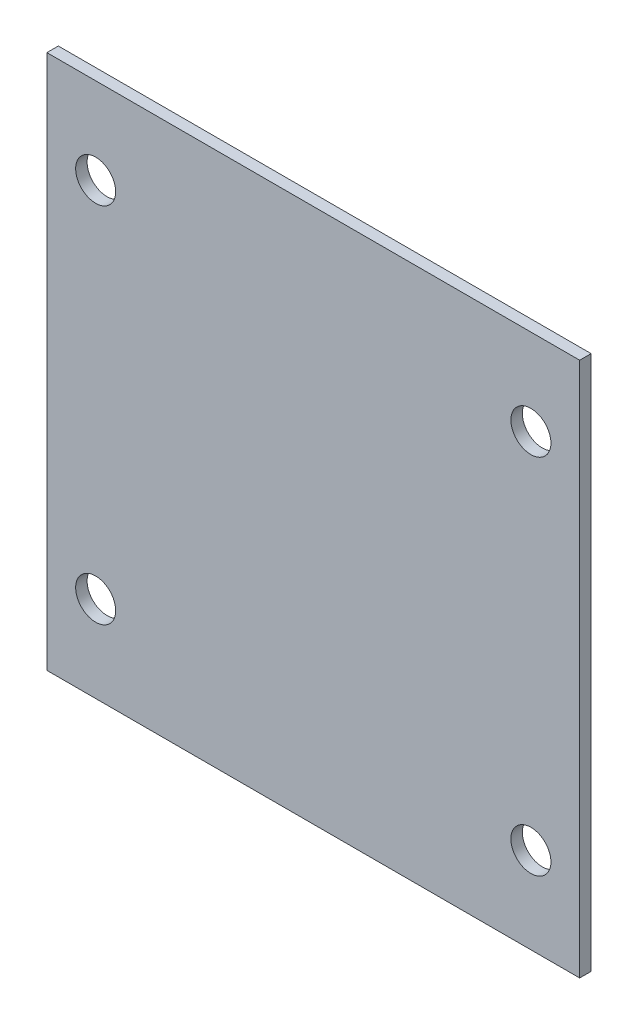
ISO-10303-21;
HEADER;
FILE_DESCRIPTION(('STEP AP214'),'2;1');
FILE_NAME('part.step','',(''),(''),'','','');
FILE_SCHEMA(('AUTOMOTIVE_DESIGN { 1 0 10303 214 1 1 1 1 }'));
ENDSEC;
DATA;
#1=APPLICATION_CONTEXT('core data for automotive mechanical design processes');
#2=APPLICATION_PROTOCOL_DEFINITION('international standard','automotive_design',2000,#1);
#3=PRODUCT_CONTEXT('',#1,'mechanical');
#4=PRODUCT('Part','Part','',(#3));
#5=PRODUCT_RELATED_PRODUCT_CATEGORY('part','',(#4));
#6=PRODUCT_DEFINITION_FORMATION('','',#4);
#7=PRODUCT_DEFINITION_CONTEXT('part definition',#1,'design');
#8=PRODUCT_DEFINITION('design','',#6,#7);
#9=PRODUCT_DEFINITION_SHAPE('','',#8);
#10=(LENGTH_UNIT() NAMED_UNIT(*) SI_UNIT(.MILLI.,.METRE.));
#11=(NAMED_UNIT(*) PLANE_ANGLE_UNIT() SI_UNIT($,.RADIAN.));
#12=(NAMED_UNIT(*) SI_UNIT($,.STERADIAN.) SOLID_ANGLE_UNIT());
#13=UNCERTAINTY_MEASURE_WITH_UNIT(LENGTH_MEASURE(1.E-05),#10,'distance_accuracy_value','');
#14=(GEOMETRIC_REPRESENTATION_CONTEXT(3) GLOBAL_UNCERTAINTY_ASSIGNED_CONTEXT((#13)) GLOBAL_UNIT_ASSIGNED_CONTEXT((#10,
#11,#12)) REPRESENTATION_CONTEXT('',''));
#15=CARTESIAN_POINT('',(0.,0.,0.));
#16=DIRECTION('',(0.,0.,1.));
#17=DIRECTION('',(1.,0.,0.));
#18=AXIS2_PLACEMENT_3D('',#15,#16,#17);
#19=CARTESIAN_POINT('',(0.,0.,1.));
#20=DIRECTION('',(0.,0.,1.));
#21=DIRECTION('',(1.,0.,0.));
#22=AXIS2_PLACEMENT_3D('',#19,#20,#21);
#23=PLANE('',#22);
#24=CARTESIAN_POINT('',(19.0315192717347,-15.862695549315,1.));
#25=DIRECTION('',(0.,0.,1.));
#26=DIRECTION('',(1.,0.,0.));
#27=AXIS2_PLACEMENT_3D('',#24,#25,#26);
#28=CIRCLE('',#27,1.75);
#29=CARTESIAN_POINT('',(20.7815192717347,-15.862695549315,1.));
#30=VERTEX_POINT('',#29);
#31=EDGE_CURVE('E121',#30,#30,#28,.T.);
#32=ORIENTED_EDGE('',*,*,#31,.F.);
#33=EDGE_LOOP('',(#32));
#34=FACE_BOUND('',#33,.T.);
#35=CARTESIAN_POINT('',(-19.0315192717347,15.862695549315,1.));
#36=DIRECTION('',(0.,0.,1.));
#37=DIRECTION('',(1.,0.,0.));
#38=AXIS2_PLACEMENT_3D('',#35,#36,#37);
#39=CIRCLE('',#38,1.75);
#40=CARTESIAN_POINT('',(-17.2815192717347,15.862695549315,1.));
#41=VERTEX_POINT('',#40);
#42=EDGE_CURVE('E100',#41,#41,#39,.T.);
#43=ORIENTED_EDGE('',*,*,#42,.F.);
#44=EDGE_LOOP('',(#43));
#45=FACE_BOUND('',#44,.T.);
#46=DIRECTION('',(0.,1.,0.));
#47=VECTOR('',#46,1.);
#48=CARTESIAN_POINT('',(23.2974082414595,23.394480775799,1.));
#49=LINE('',#48,#47);
#50=CARTESIAN_POINT('',(23.2974082414595,-23.394480775799,1.));
#51=VERTEX_POINT('',#50);
#52=CARTESIAN_POINT('',(23.2974082414595,23.394480775799,1.));
#53=VERTEX_POINT('',#52);
#54=EDGE_CURVE('E85',#51,#53,#49,.T.);
#55=ORIENTED_EDGE('',*,*,#54,.T.);
#56=DIRECTION('',(-1.,0.,0.));
#57=VECTOR('',#56,1.);
#58=CARTESIAN_POINT('',(-23.2974082414595,23.394480775799,1.));
#59=LINE('',#58,#57);
#60=CARTESIAN_POINT('',(-23.2974082414595,23.394480775799,1.));
#61=VERTEX_POINT('',#60);
#62=EDGE_CURVE('E80',#53,#61,#59,.T.);
#63=ORIENTED_EDGE('',*,*,#62,.T.);
#64=DIRECTION('',(0.,-1.,0.));
#65=VECTOR('',#64,1.);
#66=CARTESIAN_POINT('',(-23.2974082414595,23.394480775799,1.));
#67=LINE('',#66,#65);
#68=CARTESIAN_POINT('',(-23.2974082414595,-23.394480775799,1.));
#69=VERTEX_POINT('',#68);
#70=EDGE_CURVE('E83',#61,#69,#67,.T.);
#71=ORIENTED_EDGE('',*,*,#70,.T.);
#72=DIRECTION('',(1.,0.,0.));
#73=VECTOR('',#72,1.);
#74=CARTESIAN_POINT('',(-23.2974082414595,-23.394480775799,1.));
#75=LINE('',#74,#73);
#76=EDGE_CURVE('E50',#69,#51,#75,.T.);
#77=ORIENTED_EDGE('',*,*,#76,.T.);
#78=EDGE_LOOP('',(#55,#63,#71,#77));
#79=FACE_BOUND('',#78,.T.);
#80=CARTESIAN_POINT('',(19.0315192717347,15.862695549315,1.));
#81=DIRECTION('',(0.,0.,1.));
#82=DIRECTION('',(1.,0.,0.));
#83=AXIS2_PLACEMENT_3D('',#80,#81,#82);
#84=CIRCLE('',#83,1.75);
#85=CARTESIAN_POINT('',(20.7815192717347,15.862695549315,1.));
#86=VERTEX_POINT('',#85);
#87=EDGE_CURVE('E115',#86,#86,#84,.T.);
#88=ORIENTED_EDGE('',*,*,#87,.F.);
#89=EDGE_LOOP('',(#88));
#90=FACE_BOUND('',#89,.T.);
#91=CARTESIAN_POINT('',(-19.0315192717347,-15.862695549315,1.));
#92=DIRECTION('',(0.,0.,1.));
#93=DIRECTION('',(1.,0.,0.));
#94=AXIS2_PLACEMENT_3D('',#91,#92,#93);
#95=CIRCLE('',#94,1.75);
#96=CARTESIAN_POINT('',(-17.2815192717347,-15.862695549315,1.));
#97=VERTEX_POINT('',#96);
#98=EDGE_CURVE('E127',#97,#97,#95,.T.);
#99=ORIENTED_EDGE('',*,*,#98,.F.);
#100=EDGE_LOOP('',(#99));
#101=FACE_BOUND('',#100,.T.);
#102=ADVANCED_FACE('F33',(#34,#45,#79,#90,#101),#23,.T.);
#103=CARTESIAN_POINT('',(0.,0.,0.));
#104=DIRECTION('',(0.,0.,1.));
#105=DIRECTION('',(1.,0.,0.));
#106=AXIS2_PLACEMENT_3D('',#103,#104,#105);
#107=PLANE('',#106);
#108=DIRECTION('',(0.,1.,0.));
#109=VECTOR('',#108,1.);
#110=CARTESIAN_POINT('',(23.2974082414595,23.394480775799,0.));
#111=LINE('',#110,#109);
#112=CARTESIAN_POINT('',(23.2974082414595,-23.394480775799,0.));
#113=VERTEX_POINT('',#112);
#114=CARTESIAN_POINT('',(23.2974082414595,23.394480775799,0.));
#115=VERTEX_POINT('',#114);
#116=EDGE_CURVE('E97',#113,#115,#111,.T.);
#117=ORIENTED_EDGE('',*,*,#116,.F.);
#118=DIRECTION('',(1.,0.,0.));
#119=VECTOR('',#118,1.);
#120=CARTESIAN_POINT('',(-23.2974082414595,-23.394480775799,0.));
#121=LINE('',#120,#119);
#122=CARTESIAN_POINT('',(-23.2974082414595,-23.394480775799,0.));
#123=VERTEX_POINT('',#122);
#124=EDGE_CURVE('E73',#123,#113,#121,.T.);
#125=ORIENTED_EDGE('',*,*,#124,.F.);
#126=DIRECTION('',(0.,-1.,0.));
#127=VECTOR('',#126,1.);
#128=CARTESIAN_POINT('',(-23.2974082414595,23.394480775799,0.));
#129=LINE('',#128,#127);
#130=CARTESIAN_POINT('',(-23.2974082414595,23.394480775799,0.));
#131=VERTEX_POINT('',#130);
#132=EDGE_CURVE('E67',#131,#123,#129,.T.);
#133=ORIENTED_EDGE('',*,*,#132,.F.);
#134=DIRECTION('',(-1.,0.,0.));
#135=VECTOR('',#134,1.);
#136=CARTESIAN_POINT('',(-23.2974082414595,23.394480775799,0.));
#137=LINE('',#136,#135);
#138=EDGE_CURVE('E89',#115,#131,#137,.T.);
#139=ORIENTED_EDGE('',*,*,#138,.F.);
#140=EDGE_LOOP('',(#117,#125,#133,#139));
#141=FACE_BOUND('',#140,.T.);
#142=CARTESIAN_POINT('',(-19.0315192717347,15.862695549315,0.));
#143=DIRECTION('',(0.,0.,1.));
#144=DIRECTION('',(1.,0.,0.));
#145=AXIS2_PLACEMENT_3D('',#142,#143,#144);
#146=CIRCLE('',#145,1.75);
#147=CARTESIAN_POINT('',(-17.2815192717347,15.862695549315,0.));
#148=VERTEX_POINT('',#147);
#149=EDGE_CURVE('E112',#148,#148,#146,.T.);
#150=ORIENTED_EDGE('',*,*,#149,.T.);
#151=EDGE_LOOP('',(#150));
#152=FACE_BOUND('',#151,.T.);
#153=CARTESIAN_POINT('',(19.0315192717347,15.862695549315,0.));
#154=DIRECTION('',(0.,0.,1.));
#155=DIRECTION('',(1.,0.,0.));
#156=AXIS2_PLACEMENT_3D('',#153,#154,#155);
#157=CIRCLE('',#156,1.75);
#158=CARTESIAN_POINT('',(20.7815192717347,15.862695549315,0.));
#159=VERTEX_POINT('',#158);
#160=EDGE_CURVE('E118',#159,#159,#157,.T.);
#161=ORIENTED_EDGE('',*,*,#160,.T.);
#162=EDGE_LOOP('',(#161));
#163=FACE_BOUND('',#162,.T.);
#164=CARTESIAN_POINT('',(19.0315192717347,-15.862695549315,0.));
#165=DIRECTION('',(0.,0.,1.));
#166=DIRECTION('',(1.,0.,0.));
#167=AXIS2_PLACEMENT_3D('',#164,#165,#166);
#168=CIRCLE('',#167,1.75);
#169=CARTESIAN_POINT('',(20.7815192717347,-15.862695549315,0.));
#170=VERTEX_POINT('',#169);
#171=EDGE_CURVE('E124',#170,#170,#168,.T.);
#172=ORIENTED_EDGE('',*,*,#171,.T.);
#173=EDGE_LOOP('',(#172));
#174=FACE_BOUND('',#173,.T.);
#175=CARTESIAN_POINT('',(-19.0315192717347,-15.862695549315,0.));
#176=DIRECTION('',(0.,0.,1.));
#177=DIRECTION('',(1.,0.,0.));
#178=AXIS2_PLACEMENT_3D('',#175,#176,#177);
#179=CIRCLE('',#178,1.75);
#180=CARTESIAN_POINT('',(-17.2815192717347,-15.862695549315,0.));
#181=VERTEX_POINT('',#180);
#182=EDGE_CURVE('E130',#181,#181,#179,.T.);
#183=ORIENTED_EDGE('',*,*,#182,.T.);
#184=EDGE_LOOP('',(#183));
#185=FACE_BOUND('',#184,.T.);
#186=ADVANCED_FACE('F108',(#141,#152,#163,#174,#185),#107,.F.);
#187=CARTESIAN_POINT('',(23.2974082414595,23.394480775799,1.));
#188=DIRECTION('',(-1.,0.,0.));
#189=DIRECTION('',(0.,0.,1.));
#190=AXIS2_PLACEMENT_3D('',#187,#188,#189);
#191=PLANE('',#190);
#192=ORIENTED_EDGE('',*,*,#116,.T.);
#193=DIRECTION('',(0.,0.,-1.));
#194=VECTOR('',#193,1.);
#195=CARTESIAN_POINT('',(23.2974082414595,23.394480775799,1.));
#196=LINE('',#195,#194);
#197=EDGE_CURVE('E11',#53,#115,#196,.T.);
#198=ORIENTED_EDGE('',*,*,#197,.F.);
#199=ORIENTED_EDGE('',*,*,#54,.F.);
#200=DIRECTION('',(0.,0.,-1.));
#201=VECTOR('',#200,1.);
#202=CARTESIAN_POINT('',(23.2974082414595,-23.394480775799,1.));
#203=LINE('',#202,#201);
#204=EDGE_CURVE('E93',#51,#113,#203,.T.);
#205=ORIENTED_EDGE('',*,*,#204,.T.);
#206=EDGE_LOOP('',(#192,#198,#199,#205));
#207=FACE_BOUND('',#206,.T.);
#208=ADVANCED_FACE('F35',(#207),#191,.F.);
#209=CARTESIAN_POINT('',(-23.2974082414595,23.394480775799,1.));
#210=DIRECTION('',(0.,-1.,0.));
#211=DIRECTION('',(0.,0.,-1.));
#212=AXIS2_PLACEMENT_3D('',#209,#210,#211);
#213=PLANE('',#212);
#214=ORIENTED_EDGE('',*,*,#138,.T.);
#215=DIRECTION('',(0.,0.,-1.));
#216=VECTOR('',#215,1.);
#217=CARTESIAN_POINT('',(-23.2974082414595,23.394480775799,1.));
#218=LINE('',#217,#216);
#219=EDGE_CURVE('E42',#61,#131,#218,.T.);
#220=ORIENTED_EDGE('',*,*,#219,.F.);
#221=ORIENTED_EDGE('',*,*,#62,.F.);
#222=ORIENTED_EDGE('',*,*,#197,.T.);
#223=EDGE_LOOP('',(#214,#220,#221,#222));
#224=FACE_BOUND('',#223,.T.);
#225=ADVANCED_FACE('F88',(#224),#213,.F.);
#226=CARTESIAN_POINT('',(-23.2974082414595,23.394480775799,1.));
#227=DIRECTION('',(1.,0.,0.));
#228=DIRECTION('',(0.,0.,-1.));
#229=AXIS2_PLACEMENT_3D('',#226,#227,#228);
#230=PLANE('',#229);
#231=ORIENTED_EDGE('',*,*,#132,.T.);
#232=DIRECTION('',(0.,0.,-1.));
#233=VECTOR('',#232,1.);
#234=CARTESIAN_POINT('',(-23.2974082414595,-23.394480775799,1.));
#235=LINE('',#234,#233);
#236=EDGE_CURVE('E90',#69,#123,#235,.T.);
#237=ORIENTED_EDGE('',*,*,#236,.F.);
#238=ORIENTED_EDGE('',*,*,#70,.F.);
#239=ORIENTED_EDGE('',*,*,#219,.T.);
#240=EDGE_LOOP('',(#231,#237,#238,#239));
#241=FACE_BOUND('',#240,.T.);
#242=ADVANCED_FACE('F91',(#241),#230,.F.);
#243=CARTESIAN_POINT('',(-23.2974082414595,-23.394480775799,1.));
#244=DIRECTION('',(0.,1.,0.));
#245=DIRECTION('',(0.,0.,1.));
#246=AXIS2_PLACEMENT_3D('',#243,#244,#245);
#247=PLANE('',#246);
#248=ORIENTED_EDGE('',*,*,#124,.T.);
#249=ORIENTED_EDGE('',*,*,#204,.F.);
#250=ORIENTED_EDGE('',*,*,#76,.F.);
#251=ORIENTED_EDGE('',*,*,#236,.T.);
#252=EDGE_LOOP('',(#248,#249,#250,#251));
#253=FACE_BOUND('',#252,.T.);
#254=ADVANCED_FACE('F105',(#253),#247,.F.);
#255=CARTESIAN_POINT('',(-19.0315192717347,15.862695549315,1.));
#256=DIRECTION('',(0.,0.,-1.));
#257=DIRECTION('',(-1.,0.,0.));
#258=AXIS2_PLACEMENT_3D('',#255,#256,#257);
#259=CYLINDRICAL_SURFACE('',#258,1.75);
#260=ORIENTED_EDGE('',*,*,#42,.T.);
#261=EDGE_LOOP('',(#260));
#262=FACE_BOUND('',#261,.T.);
#263=ORIENTED_EDGE('',*,*,#149,.F.);
#264=EDGE_LOOP('',(#263));
#265=FACE_BOUND('',#264,.T.);
#266=ADVANCED_FACE('F149',(#262,#265),#259,.F.);
#267=CARTESIAN_POINT('',(19.0315192717347,15.862695549315,1.));
#268=DIRECTION('',(0.,0.,-1.));
#269=DIRECTION('',(-1.,0.,0.));
#270=AXIS2_PLACEMENT_3D('',#267,#268,#269);
#271=CYLINDRICAL_SURFACE('',#270,1.75);
#272=ORIENTED_EDGE('',*,*,#87,.T.);
#273=EDGE_LOOP('',(#272));
#274=FACE_BOUND('',#273,.T.);
#275=ORIENTED_EDGE('',*,*,#160,.F.);
#276=EDGE_LOOP('',(#275));
#277=FACE_BOUND('',#276,.T.);
#278=ADVANCED_FACE('F195',(#274,#277),#271,.F.);
#279=CARTESIAN_POINT('',(19.0315192717347,-15.862695549315,1.));
#280=DIRECTION('',(0.,0.,-1.));
#281=DIRECTION('',(-1.,0.,0.));
#282=AXIS2_PLACEMENT_3D('',#279,#280,#281);
#283=CYLINDRICAL_SURFACE('',#282,1.75);
#284=ORIENTED_EDGE('',*,*,#31,.T.);
#285=EDGE_LOOP('',(#284));
#286=FACE_BOUND('',#285,.T.);
#287=ORIENTED_EDGE('',*,*,#171,.F.);
#288=EDGE_LOOP('',(#287));
#289=FACE_BOUND('',#288,.T.);
#290=ADVANCED_FACE('F203',(#286,#289),#283,.F.);
#291=CARTESIAN_POINT('',(-19.0315192717347,-15.862695549315,1.));
#292=DIRECTION('',(0.,0.,-1.));
#293=DIRECTION('',(-1.,0.,0.));
#294=AXIS2_PLACEMENT_3D('',#291,#292,#293);
#295=CYLINDRICAL_SURFACE('',#294,1.75);
#296=ORIENTED_EDGE('',*,*,#98,.T.);
#297=EDGE_LOOP('',(#296));
#298=FACE_BOUND('',#297,.T.);
#299=ORIENTED_EDGE('',*,*,#182,.F.);
#300=EDGE_LOOP('',(#299));
#301=FACE_BOUND('',#300,.T.);
#302=ADVANCED_FACE('F136',(#298,#301),#295,.F.);
#303=CLOSED_SHELL('',(#102,#186,#208,#225,#242,#254,#266,#278,#290,#302));
#304=MANIFOLD_SOLID_BREP('B2',#303);
#305=ADVANCED_BREP_SHAPE_REPRESENTATION('',(#18,#304),#14);
#306=SHAPE_DEFINITION_REPRESENTATION(#9,#305);
ENDSEC;
END-ISO-10303-21;
